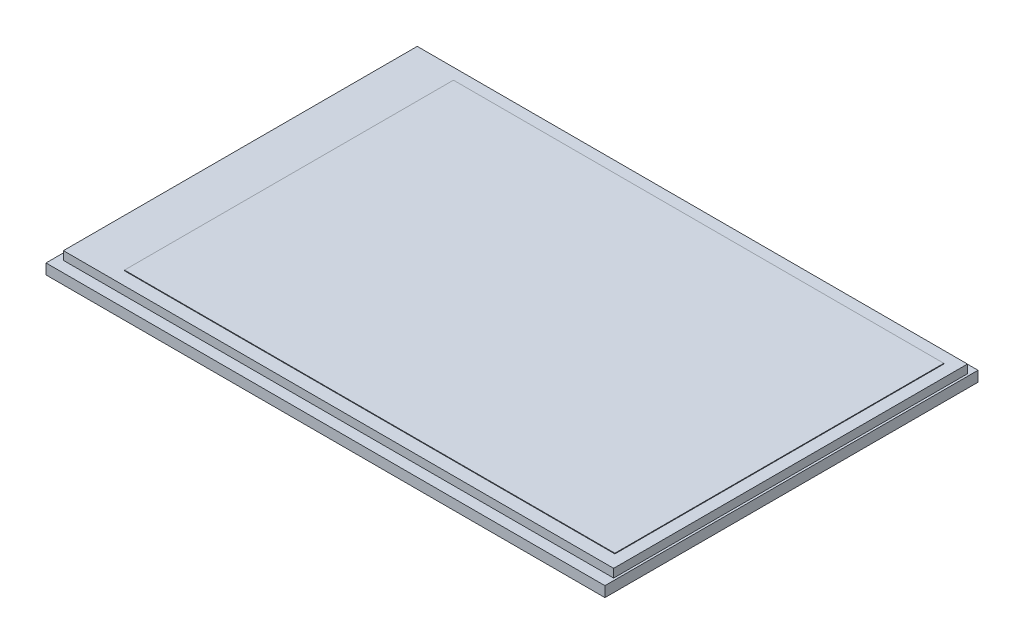
ISO-10303-21;
HEADER;
FILE_DESCRIPTION(('STEP AP214'),'2;1');
FILE_NAME('part.step','',(''),(''),'','','');
FILE_SCHEMA(('AUTOMOTIVE_DESIGN { 1 0 10303 214 1 1 1 1 }'));
ENDSEC;
DATA;
#1=APPLICATION_CONTEXT('core data for automotive mechanical design processes');
#2=APPLICATION_PROTOCOL_DEFINITION('international standard','automotive_design',2000,#1);
#3=PRODUCT_CONTEXT('',#1,'mechanical');
#4=PRODUCT('Part','Part','',(#3));
#5=PRODUCT_RELATED_PRODUCT_CATEGORY('part','',(#4));
#6=PRODUCT_DEFINITION_FORMATION('','',#4);
#7=PRODUCT_DEFINITION_CONTEXT('part definition',#1,'design');
#8=PRODUCT_DEFINITION('design','',#6,#7);
#9=PRODUCT_DEFINITION_SHAPE('','',#8);
#10=(LENGTH_UNIT() NAMED_UNIT(*) SI_UNIT(.MILLI.,.METRE.));
#11=(NAMED_UNIT(*) PLANE_ANGLE_UNIT() SI_UNIT($,.RADIAN.));
#12=(NAMED_UNIT(*) SI_UNIT($,.STERADIAN.) SOLID_ANGLE_UNIT());
#13=UNCERTAINTY_MEASURE_WITH_UNIT(LENGTH_MEASURE(1.E-05),#10,'distance_accuracy_value','');
#14=(GEOMETRIC_REPRESENTATION_CONTEXT(3) GLOBAL_UNCERTAINTY_ASSIGNED_CONTEXT((#13)) GLOBAL_UNIT_ASSIGNED_CONTEXT((#10,
#11,#12)) REPRESENTATION_CONTEXT('',''));
#15=CARTESIAN_POINT('',(0.,0.,0.));
#16=DIRECTION('',(0.,0.,1.));
#17=DIRECTION('',(1.,0.,0.));
#18=AXIS2_PLACEMENT_3D('',#15,#16,#17);
#19=CARTESIAN_POINT('',(0.,0.,0.));
#20=DIRECTION('',(0.,1.,0.));
#21=DIRECTION('',(0.,0.,1.));
#22=AXIS2_PLACEMENT_3D('',#19,#20,#21);
#23=PLANE('',#22);
#24=DIRECTION('',(0.,0.,1.));
#25=VECTOR('',#24,1.);
#26=CARTESIAN_POINT('',(-44.7916666666667,0.,-23.8888888888888));
#27=LINE('',#26,#25);
#28=CARTESIAN_POINT('',(-44.7916666666667,0.,-23.8888888888888));
#29=VERTEX_POINT('',#28);
#30=CARTESIAN_POINT('',(-44.7916666666667,0.,33.5111111111112));
#31=VERTEX_POINT('',#30);
#32=EDGE_CURVE('E244',#29,#31,#27,.T.);
#33=ORIENTED_EDGE('',*,*,#32,.F.);
#34=DIRECTION('',(-1.,0.,0.));
#35=VECTOR('',#34,1.);
#36=CARTESIAN_POINT('',(-44.7916666666667,0.,-23.8888888888888));
#37=LINE('',#36,#35);
#38=CARTESIAN_POINT('',(41.2083333333333,0.,-23.8888888888888));
#39=VERTEX_POINT('',#38);
#40=EDGE_CURVE('E249',#39,#29,#37,.T.);
#41=ORIENTED_EDGE('',*,*,#40,.F.);
#42=DIRECTION('',(0.,0.,-1.));
#43=VECTOR('',#42,1.);
#44=CARTESIAN_POINT('',(41.2083333333333,0.,-23.8888888888888));
#45=LINE('',#44,#43);
#46=CARTESIAN_POINT('',(41.2083333333333,0.,33.5111111111112));
#47=VERTEX_POINT('',#46);
#48=EDGE_CURVE('E260',#47,#39,#45,.T.);
#49=ORIENTED_EDGE('',*,*,#48,.F.);
#50=DIRECTION('',(1.,0.,0.));
#51=VECTOR('',#50,1.);
#52=CARTESIAN_POINT('',(-44.7916666666667,0.,33.5111111111112));
#53=LINE('',#52,#51);
#54=EDGE_CURVE('E258',#31,#47,#53,.T.);
#55=ORIENTED_EDGE('',*,*,#54,.F.);
#56=EDGE_LOOP('',(#33,#41,#49,#55));
#57=FACE_BOUND('',#56,.T.);
#58=DIRECTION('',(0.,0.,-1.));
#59=VECTOR('',#58,1.);
#60=CARTESIAN_POINT('',(-37.2516666666667,0.,-17.1988888888888));
#61=LINE('',#60,#59);
#62=CARTESIAN_POINT('',(-37.2516666666667,0.,-17.1988888888888));
#63=VERTEX_POINT('',#62);
#64=CARTESIAN_POINT('',(-37.2516666666667,0.,-22.1988888888888));
#65=VERTEX_POINT('',#64);
#66=EDGE_CURVE('E172',#63,#65,#61,.T.);
#67=ORIENTED_EDGE('',*,*,#66,.F.);
#68=DIRECTION('',(-1.,0.,0.));
#69=VECTOR('',#68,1.);
#70=CARTESIAN_POINT('',(-37.2516666666667,0.,-17.1988888888888));
#71=LINE('',#70,#69);
#72=CARTESIAN_POINT('',(13.9183333333333,0.,-17.1988888888888));
#73=VERTEX_POINT('',#72);
#74=EDGE_CURVE('E169',#73,#63,#71,.T.);
#75=ORIENTED_EDGE('',*,*,#74,.F.);
#76=DIRECTION('',(0.,0.,1.));
#77=VECTOR('',#76,1.);
#78=CARTESIAN_POINT('',(13.9183333333333,0.,-17.1988888888888));
#79=LINE('',#78,#77);
#80=CARTESIAN_POINT('',(13.9183333333333,0.,-22.1988888888888));
#81=VERTEX_POINT('',#80);
#82=EDGE_CURVE('E59',#81,#73,#79,.T.);
#83=ORIENTED_EDGE('',*,*,#82,.F.);
#84=DIRECTION('',(1.,0.,0.));
#85=VECTOR('',#84,1.);
#86=CARTESIAN_POINT('',(-37.2516666666667,0.,-22.1988888888888));
#87=LINE('',#86,#85);
#88=EDGE_CURVE('E54',#65,#81,#87,.T.);
#89=ORIENTED_EDGE('',*,*,#88,.F.);
#90=EDGE_LOOP('',(#67,#75,#83,#89));
#91=FACE_BOUND('',#90,.T.);
#92=ADVANCED_FACE('F39',(#57,#91),#23,.F.);
#93=CARTESIAN_POINT('',(-44.7916666666667,1.6,-23.8888888888888));
#94=DIRECTION('',(1.,0.,0.));
#95=DIRECTION('',(0.,0.,-1.));
#96=AXIS2_PLACEMENT_3D('',#93,#94,#95);
#97=PLANE('',#96);
#98=ORIENTED_EDGE('',*,*,#32,.T.);
#99=DIRECTION('',(0.,-1.,0.));
#100=VECTOR('',#99,1.);
#101=CARTESIAN_POINT('',(-44.7916666666667,1.6,33.5111111111112));
#102=LINE('',#101,#100);
#103=CARTESIAN_POINT('',(-44.7916666666667,1.6,33.5111111111112));
#104=VERTEX_POINT('',#103);
#105=EDGE_CURVE('E11',#104,#31,#102,.T.);
#106=ORIENTED_EDGE('',*,*,#105,.F.);
#107=DIRECTION('',(0.,0.,1.));
#108=VECTOR('',#107,1.);
#109=CARTESIAN_POINT('',(-44.7916666666667,1.6,-23.8888888888888));
#110=LINE('',#109,#108);
#111=CARTESIAN_POINT('',(-44.7916666666667,1.6,-23.8888888888888));
#112=VERTEX_POINT('',#111);
#113=EDGE_CURVE('E245',#112,#104,#110,.T.);
#114=ORIENTED_EDGE('',*,*,#113,.F.);
#115=DIRECTION('',(0.,-1.,0.));
#116=VECTOR('',#115,1.);
#117=CARTESIAN_POINT('',(-44.7916666666667,1.6,-23.8888888888888));
#118=LINE('',#117,#116);
#119=EDGE_CURVE('E255',#112,#29,#118,.T.);
#120=ORIENTED_EDGE('',*,*,#119,.T.);
#121=EDGE_LOOP('',(#98,#106,#114,#120));
#122=FACE_BOUND('',#121,.T.);
#123=ADVANCED_FACE('F41',(#122),#97,.F.);
#124=CARTESIAN_POINT('',(-44.7916666666667,1.6,33.5111111111112));
#125=DIRECTION('',(0.,0.,-1.));
#126=DIRECTION('',(-1.,0.,0.));
#127=AXIS2_PLACEMENT_3D('',#124,#125,#126);
#128=PLANE('',#127);
#129=ORIENTED_EDGE('',*,*,#54,.T.);
#130=DIRECTION('',(0.,-1.,0.));
#131=VECTOR('',#130,1.);
#132=CARTESIAN_POINT('',(41.2083333333333,1.6,33.5111111111112));
#133=LINE('',#132,#131);
#134=CARTESIAN_POINT('',(41.2083333333333,1.6,33.5111111111112));
#135=VERTEX_POINT('',#134);
#136=EDGE_CURVE('E47',#135,#47,#133,.T.);
#137=ORIENTED_EDGE('',*,*,#136,.F.);
#138=DIRECTION('',(1.,0.,0.));
#139=VECTOR('',#138,1.);
#140=CARTESIAN_POINT('',(-44.7916666666667,1.6,33.5111111111112));
#141=LINE('',#140,#139);
#142=EDGE_CURVE('E248',#104,#135,#141,.T.);
#143=ORIENTED_EDGE('',*,*,#142,.F.);
#144=ORIENTED_EDGE('',*,*,#105,.T.);
#145=EDGE_LOOP('',(#129,#137,#143,#144));
#146=FACE_BOUND('',#145,.T.);
#147=ADVANCED_FACE('F287',(#146),#128,.F.);
#148=CARTESIAN_POINT('',(41.2083333333333,1.6,-23.8888888888888));
#149=DIRECTION('',(-1.,0.,0.));
#150=DIRECTION('',(0.,0.,1.));
#151=AXIS2_PLACEMENT_3D('',#148,#149,#150);
#152=PLANE('',#151);
#153=ORIENTED_EDGE('',*,*,#48,.T.);
#154=DIRECTION('',(0.,-1.,0.));
#155=VECTOR('',#154,1.);
#156=CARTESIAN_POINT('',(41.2083333333333,1.6,-23.8888888888888));
#157=LINE('',#156,#155);
#158=CARTESIAN_POINT('',(41.2083333333333,1.6,-23.8888888888888));
#159=VERTEX_POINT('',#158);
#160=EDGE_CURVE('E265',#159,#39,#157,.T.);
#161=ORIENTED_EDGE('',*,*,#160,.F.);
#162=DIRECTION('',(0.,0.,-1.));
#163=VECTOR('',#162,1.);
#164=CARTESIAN_POINT('',(41.2083333333333,1.6,-23.8888888888888));
#165=LINE('',#164,#163);
#166=EDGE_CURVE('E251',#135,#159,#165,.T.);
#167=ORIENTED_EDGE('',*,*,#166,.F.);
#168=ORIENTED_EDGE('',*,*,#136,.T.);
#169=EDGE_LOOP('',(#153,#161,#167,#168));
#170=FACE_BOUND('',#169,.T.);
#171=ADVANCED_FACE('F272',(#170),#152,.F.);
#172=CARTESIAN_POINT('',(-44.7916666666667,1.6,-23.8888888888888));
#173=DIRECTION('',(0.,0.,1.));
#174=DIRECTION('',(1.,0.,0.));
#175=AXIS2_PLACEMENT_3D('',#172,#173,#174);
#176=PLANE('',#175);
#177=ORIENTED_EDGE('',*,*,#40,.T.);
#178=ORIENTED_EDGE('',*,*,#119,.F.);
#179=DIRECTION('',(-1.,0.,0.));
#180=VECTOR('',#179,1.);
#181=CARTESIAN_POINT('',(-44.7916666666667,1.6,-23.8888888888888));
#182=LINE('',#181,#180);
#183=EDGE_CURVE('E253',#159,#112,#182,.T.);
#184=ORIENTED_EDGE('',*,*,#183,.F.);
#185=ORIENTED_EDGE('',*,*,#160,.T.);
#186=EDGE_LOOP('',(#177,#178,#184,#185));
#187=FACE_BOUND('',#186,.T.);
#188=ADVANCED_FACE('F280',(#187),#176,.F.);
#189=CARTESIAN_POINT('',(0.,1.6,0.));
#190=DIRECTION('',(0.,1.,0.));
#191=DIRECTION('',(0.,0.,1.));
#192=AXIS2_PLACEMENT_3D('',#189,#190,#191);
#193=PLANE('',#192);
#194=DIRECTION('',(0.,0.,1.));
#195=VECTOR('',#194,1.);
#196=CARTESIAN_POINT('',(-43.7916666666667,1.6,-22.6088888888888));
#197=LINE('',#196,#195);
#198=CARTESIAN_POINT('',(-43.7916666666667,1.6,-22.6088888888888));
#199=VERTEX_POINT('',#198);
#200=CARTESIAN_POINT('',(-43.7916666666667,1.6,31.8311111111112));
#201=VERTEX_POINT('',#200);
#202=EDGE_CURVE('E211',#199,#201,#197,.T.);
#203=ORIENTED_EDGE('',*,*,#202,.F.);
#204=DIRECTION('',(-1.,0.,0.));
#205=VECTOR('',#204,1.);
#206=CARTESIAN_POINT('',(-43.7916666666667,1.6,-22.6088888888888));
#207=LINE('',#206,#205);
#208=CARTESIAN_POINT('',(40.8683333333333,1.6,-22.6088888888888));
#209=VERTEX_POINT('',#208);
#210=EDGE_CURVE('E216',#209,#199,#207,.T.);
#211=ORIENTED_EDGE('',*,*,#210,.F.);
#212=DIRECTION('',(0.,0.,-1.));
#213=VECTOR('',#212,1.);
#214=CARTESIAN_POINT('',(40.8683333333333,1.6,-22.6088888888888));
#215=LINE('',#214,#213);
#216=CARTESIAN_POINT('',(40.8683333333333,1.6,31.8311111111112));
#217=VERTEX_POINT('',#216);
#218=EDGE_CURVE('E228',#217,#209,#215,.T.);
#219=ORIENTED_EDGE('',*,*,#218,.F.);
#220=DIRECTION('',(1.,0.,0.));
#221=VECTOR('',#220,1.);
#222=CARTESIAN_POINT('',(-43.7916666666667,1.6,31.8311111111112));
#223=LINE('',#222,#221);
#224=EDGE_CURVE('E225',#201,#217,#223,.T.);
#225=ORIENTED_EDGE('',*,*,#224,.F.);
#226=EDGE_LOOP('',(#203,#211,#219,#225));
#227=FACE_BOUND('',#226,.T.);
#228=ORIENTED_EDGE('',*,*,#113,.T.);
#229=ORIENTED_EDGE('',*,*,#142,.T.);
#230=ORIENTED_EDGE('',*,*,#166,.T.);
#231=ORIENTED_EDGE('',*,*,#183,.T.);
#232=EDGE_LOOP('',(#228,#229,#230,#231));
#233=FACE_BOUND('',#232,.T.);
#234=ADVANCED_FACE('F286',(#227,#233),#193,.T.);
#235=CARTESIAN_POINT('',(-43.7916666666667,2.9,-22.6088888888888));
#236=DIRECTION('',(1.,0.,0.));
#237=DIRECTION('',(0.,0.,-1.));
#238=AXIS2_PLACEMENT_3D('',#235,#236,#237);
#239=PLANE('',#238);
#240=ORIENTED_EDGE('',*,*,#202,.T.);
#241=DIRECTION('',(0.,-1.,0.));
#242=VECTOR('',#241,1.);
#243=CARTESIAN_POINT('',(-43.7916666666667,2.9,31.8311111111112));
#244=LINE('',#243,#242);
#245=CARTESIAN_POINT('',(-43.7916666666667,2.9,31.8311111111112));
#246=VERTEX_POINT('',#245);
#247=EDGE_CURVE('E241',#246,#201,#244,.T.);
#248=ORIENTED_EDGE('',*,*,#247,.F.);
#249=DIRECTION('',(0.,0.,1.));
#250=VECTOR('',#249,1.);
#251=CARTESIAN_POINT('',(-43.7916666666667,2.9,-22.6088888888888));
#252=LINE('',#251,#250);
#253=CARTESIAN_POINT('',(-43.7916666666667,2.9,-22.6088888888888));
#254=VERTEX_POINT('',#253);
#255=EDGE_CURVE('E212',#254,#246,#252,.T.);
#256=ORIENTED_EDGE('',*,*,#255,.F.);
#257=DIRECTION('',(0.,-1.,0.));
#258=VECTOR('',#257,1.);
#259=CARTESIAN_POINT('',(-43.7916666666667,2.9,-22.6088888888888));
#260=LINE('',#259,#258);
#261=EDGE_CURVE('E222',#254,#199,#260,.T.);
#262=ORIENTED_EDGE('',*,*,#261,.T.);
#263=EDGE_LOOP('',(#240,#248,#256,#262));
#264=FACE_BOUND('',#263,.T.);
#265=ADVANCED_FACE('F305',(#264),#239,.F.);
#266=CARTESIAN_POINT('',(-43.7916666666667,2.9,31.8311111111112));
#267=DIRECTION('',(0.,0.,-1.));
#268=DIRECTION('',(-1.,0.,0.));
#269=AXIS2_PLACEMENT_3D('',#266,#267,#268);
#270=PLANE('',#269);
#271=ORIENTED_EDGE('',*,*,#224,.T.);
#272=DIRECTION('',(0.,-1.,0.));
#273=VECTOR('',#272,1.);
#274=CARTESIAN_POINT('',(40.8683333333333,2.9,31.8311111111112));
#275=LINE('',#274,#273);
#276=CARTESIAN_POINT('',(40.8683333333333,2.9,31.8311111111112));
#277=VERTEX_POINT('',#276);
#278=EDGE_CURVE('E238',#277,#217,#275,.T.);
#279=ORIENTED_EDGE('',*,*,#278,.F.);
#280=DIRECTION('',(1.,0.,0.));
#281=VECTOR('',#280,1.);
#282=CARTESIAN_POINT('',(-43.7916666666667,2.9,31.8311111111112));
#283=LINE('',#282,#281);
#284=EDGE_CURVE('E215',#246,#277,#283,.T.);
#285=ORIENTED_EDGE('',*,*,#284,.F.);
#286=ORIENTED_EDGE('',*,*,#247,.T.);
#287=EDGE_LOOP('',(#271,#279,#285,#286));
#288=FACE_BOUND('',#287,.T.);
#289=ADVANCED_FACE('F310',(#288),#270,.F.);
#290=CARTESIAN_POINT('',(40.8683333333333,2.9,-22.6088888888888));
#291=DIRECTION('',(-1.,0.,0.));
#292=DIRECTION('',(0.,0.,1.));
#293=AXIS2_PLACEMENT_3D('',#290,#291,#292);
#294=PLANE('',#293);
#295=ORIENTED_EDGE('',*,*,#218,.T.);
#296=DIRECTION('',(0.,-1.,0.));
#297=VECTOR('',#296,1.);
#298=CARTESIAN_POINT('',(40.8683333333333,2.9,-22.6088888888888));
#299=LINE('',#298,#297);
#300=CARTESIAN_POINT('',(40.8683333333333,2.9,-22.6088888888888));
#301=VERTEX_POINT('',#300);
#302=EDGE_CURVE('E235',#301,#209,#299,.T.);
#303=ORIENTED_EDGE('',*,*,#302,.F.);
#304=DIRECTION('',(0.,0.,-1.));
#305=VECTOR('',#304,1.);
#306=CARTESIAN_POINT('',(40.8683333333333,2.9,-22.6088888888888));
#307=LINE('',#306,#305);
#308=EDGE_CURVE('E218',#277,#301,#307,.T.);
#309=ORIENTED_EDGE('',*,*,#308,.F.);
#310=ORIENTED_EDGE('',*,*,#278,.T.);
#311=EDGE_LOOP('',(#295,#303,#309,#310));
#312=FACE_BOUND('',#311,.T.);
#313=ADVANCED_FACE('F324',(#312),#294,.F.);
#314=CARTESIAN_POINT('',(-43.7916666666667,2.9,-22.6088888888888));
#315=DIRECTION('',(0.,0.,1.));
#316=DIRECTION('',(1.,0.,0.));
#317=AXIS2_PLACEMENT_3D('',#314,#315,#316);
#318=PLANE('',#317);
#319=ORIENTED_EDGE('',*,*,#210,.T.);
#320=ORIENTED_EDGE('',*,*,#261,.F.);
#321=DIRECTION('',(-1.,0.,0.));
#322=VECTOR('',#321,1.);
#323=CARTESIAN_POINT('',(-43.7916666666667,2.9,-22.6088888888888));
#324=LINE('',#323,#322);
#325=EDGE_CURVE('E220',#301,#254,#324,.T.);
#326=ORIENTED_EDGE('',*,*,#325,.F.);
#327=ORIENTED_EDGE('',*,*,#302,.T.);
#328=EDGE_LOOP('',(#319,#320,#326,#327));
#329=FACE_BOUND('',#328,.T.);
#330=ADVANCED_FACE('F315',(#329),#318,.F.);
#331=CARTESIAN_POINT('',(0.,2.9,0.));
#332=DIRECTION('',(0.,1.,0.));
#333=DIRECTION('',(0.,0.,1.));
#334=AXIS2_PLACEMENT_3D('',#331,#332,#333);
#335=PLANE('',#334);
#336=DIRECTION('',(0.,0.,1.));
#337=VECTOR('',#336,1.);
#338=CARTESIAN_POINT('',(-36.4016666666667,2.9,-20.7888888888888));
#339=LINE('',#338,#337);
#340=CARTESIAN_POINT('',(-36.4016666666667,2.9,-20.7888888888888));
#341=VERTEX_POINT('',#340);
#342=CARTESIAN_POINT('',(-36.4016666666667,2.9,29.8211111111112));
#343=VERTEX_POINT('',#342);
#344=EDGE_CURVE('E173',#341,#343,#339,.T.);
#345=ORIENTED_EDGE('',*,*,#344,.F.);
#346=DIRECTION('',(-1.,0.,0.));
#347=VECTOR('',#346,1.);
#348=CARTESIAN_POINT('',(-36.4016666666667,2.9,-20.7888888888888));
#349=LINE('',#348,#347);
#350=CARTESIAN_POINT('',(39.0483333333333,2.9,-20.7888888888888));
#351=VERTEX_POINT('',#350);
#352=EDGE_CURVE('E186',#351,#341,#349,.T.);
#353=ORIENTED_EDGE('',*,*,#352,.F.);
#354=DIRECTION('',(0.,0.,-1.));
#355=VECTOR('',#354,1.);
#356=CARTESIAN_POINT('',(39.0483333333333,2.9,-20.7888888888888));
#357=LINE('',#356,#355);
#358=CARTESIAN_POINT('',(39.0483333333333,2.9,29.8211111111112));
#359=VERTEX_POINT('',#358);
#360=EDGE_CURVE('E195',#359,#351,#357,.T.);
#361=ORIENTED_EDGE('',*,*,#360,.F.);
#362=DIRECTION('',(1.,0.,0.));
#363=VECTOR('',#362,1.);
#364=CARTESIAN_POINT('',(-36.4016666666667,2.9,29.8211111111112));
#365=LINE('',#364,#363);
#366=EDGE_CURVE('E176',#343,#359,#365,.T.);
#367=ORIENTED_EDGE('',*,*,#366,.F.);
#368=EDGE_LOOP('',(#345,#353,#361,#367));
#369=FACE_BOUND('',#368,.T.);
#370=ORIENTED_EDGE('',*,*,#255,.T.);
#371=ORIENTED_EDGE('',*,*,#284,.T.);
#372=ORIENTED_EDGE('',*,*,#308,.T.);
#373=ORIENTED_EDGE('',*,*,#325,.T.);
#374=EDGE_LOOP('',(#370,#371,#372,#373));
#375=FACE_BOUND('',#374,.T.);
#376=ADVANCED_FACE('F320',(#369,#375),#335,.T.);
#377=CARTESIAN_POINT('',(-36.4016666666667,3.,-20.7888888888888));
#378=DIRECTION('',(1.,0.,0.));
#379=DIRECTION('',(0.,0.,-1.));
#380=AXIS2_PLACEMENT_3D('',#377,#378,#379);
#381=PLANE('',#380);
#382=ORIENTED_EDGE('',*,*,#344,.T.);
#383=DIRECTION('',(0.,-1.,0.));
#384=VECTOR('',#383,1.);
#385=CARTESIAN_POINT('',(-36.4016666666667,3.,29.8211111111112));
#386=LINE('',#385,#384);
#387=CARTESIAN_POINT('',(-36.4016666666667,3.,29.8211111111112));
#388=VERTEX_POINT('',#387);
#389=EDGE_CURVE('E208',#388,#343,#386,.T.);
#390=ORIENTED_EDGE('',*,*,#389,.F.);
#391=DIRECTION('',(0.,0.,1.));
#392=VECTOR('',#391,1.);
#393=CARTESIAN_POINT('',(-36.4016666666667,3.,-20.7888888888888));
#394=LINE('',#393,#392);
#395=CARTESIAN_POINT('',(-36.4016666666667,3.,-20.7888888888888));
#396=VERTEX_POINT('',#395);
#397=EDGE_CURVE('E182',#396,#388,#394,.T.);
#398=ORIENTED_EDGE('',*,*,#397,.F.);
#399=DIRECTION('',(0.,-1.,0.));
#400=VECTOR('',#399,1.);
#401=CARTESIAN_POINT('',(-36.4016666666667,3.,-20.7888888888888));
#402=LINE('',#401,#400);
#403=EDGE_CURVE('E191',#396,#341,#402,.T.);
#404=ORIENTED_EDGE('',*,*,#403,.T.);
#405=EDGE_LOOP('',(#382,#390,#398,#404));
#406=FACE_BOUND('',#405,.T.);
#407=ADVANCED_FACE('F337',(#406),#381,.F.);
#408=CARTESIAN_POINT('',(-36.4016666666667,3.,29.8211111111112));
#409=DIRECTION('',(0.,0.,-1.));
#410=DIRECTION('',(-1.,0.,0.));
#411=AXIS2_PLACEMENT_3D('',#408,#409,#410);
#412=PLANE('',#411);
#413=ORIENTED_EDGE('',*,*,#366,.T.);
#414=DIRECTION('',(0.,-1.,0.));
#415=VECTOR('',#414,1.);
#416=CARTESIAN_POINT('',(39.0483333333333,3.,29.8211111111112));
#417=LINE('',#416,#415);
#418=CARTESIAN_POINT('',(39.0483333333333,3.,29.8211111111112));
#419=VERTEX_POINT('',#418);
#420=EDGE_CURVE('E205',#419,#359,#417,.T.);
#421=ORIENTED_EDGE('',*,*,#420,.F.);
#422=DIRECTION('',(1.,0.,0.));
#423=VECTOR('',#422,1.);
#424=CARTESIAN_POINT('',(-36.4016666666667,3.,29.8211111111112));
#425=LINE('',#424,#423);
#426=EDGE_CURVE('E185',#388,#419,#425,.T.);
#427=ORIENTED_EDGE('',*,*,#426,.F.);
#428=ORIENTED_EDGE('',*,*,#389,.T.);
#429=EDGE_LOOP('',(#413,#421,#427,#428));
#430=FACE_BOUND('',#429,.T.);
#431=ADVANCED_FACE('F341',(#430),#412,.F.);
#432=CARTESIAN_POINT('',(39.0483333333333,3.,-20.7888888888888));
#433=DIRECTION('',(-1.,0.,0.));
#434=DIRECTION('',(0.,0.,1.));
#435=AXIS2_PLACEMENT_3D('',#432,#433,#434);
#436=PLANE('',#435);
#437=ORIENTED_EDGE('',*,*,#360,.T.);
#438=DIRECTION('',(0.,-1.,0.));
#439=VECTOR('',#438,1.);
#440=CARTESIAN_POINT('',(39.0483333333333,3.,-20.7888888888888));
#441=LINE('',#440,#439);
#442=CARTESIAN_POINT('',(39.0483333333333,3.,-20.7888888888888));
#443=VERTEX_POINT('',#442);
#444=EDGE_CURVE('E202',#443,#351,#441,.T.);
#445=ORIENTED_EDGE('',*,*,#444,.F.);
#446=DIRECTION('',(0.,0.,-1.));
#447=VECTOR('',#446,1.);
#448=CARTESIAN_POINT('',(39.0483333333333,3.,-20.7888888888888));
#449=LINE('',#448,#447);
#450=EDGE_CURVE('E188',#419,#443,#449,.T.);
#451=ORIENTED_EDGE('',*,*,#450,.F.);
#452=ORIENTED_EDGE('',*,*,#420,.T.);
#453=EDGE_LOOP('',(#437,#445,#451,#452));
#454=FACE_BOUND('',#453,.T.);
#455=ADVANCED_FACE('F345',(#454),#436,.F.);
#456=CARTESIAN_POINT('',(-36.4016666666667,3.,-20.7888888888888));
#457=DIRECTION('',(0.,0.,1.));
#458=DIRECTION('',(1.,0.,0.));
#459=AXIS2_PLACEMENT_3D('',#456,#457,#458);
#460=PLANE('',#459);
#461=ORIENTED_EDGE('',*,*,#352,.T.);
#462=ORIENTED_EDGE('',*,*,#403,.F.);
#463=DIRECTION('',(-1.,0.,0.));
#464=VECTOR('',#463,1.);
#465=CARTESIAN_POINT('',(-36.4016666666667,3.,-20.7888888888888));
#466=LINE('',#465,#464);
#467=EDGE_CURVE('E190',#443,#396,#466,.T.);
#468=ORIENTED_EDGE('',*,*,#467,.F.);
#469=ORIENTED_EDGE('',*,*,#444,.T.);
#470=EDGE_LOOP('',(#461,#462,#468,#469));
#471=FACE_BOUND('',#470,.T.);
#472=ADVANCED_FACE('F349',(#471),#460,.F.);
#473=CARTESIAN_POINT('',(0.,3.,0.));
#474=DIRECTION('',(0.,1.,0.));
#475=DIRECTION('',(0.,0.,1.));
#476=AXIS2_PLACEMENT_3D('',#473,#474,#475);
#477=PLANE('',#476);
#478=ORIENTED_EDGE('',*,*,#397,.T.);
#479=ORIENTED_EDGE('',*,*,#426,.T.);
#480=ORIENTED_EDGE('',*,*,#450,.T.);
#481=ORIENTED_EDGE('',*,*,#467,.T.);
#482=EDGE_LOOP('',(#478,#479,#480,#481));
#483=FACE_BOUND('',#482,.T.);
#484=ADVANCED_FACE('F353',(#483),#477,.T.);
#485=CARTESIAN_POINT('',(-37.2516666666667,-14.,-17.1988888888888));
#486=DIRECTION('',(1.,0.,0.));
#487=DIRECTION('',(0.,0.,-1.));
#488=AXIS2_PLACEMENT_3D('',#485,#486,#487);
#489=PLANE('',#488);
#490=ORIENTED_EDGE('',*,*,#66,.T.);
#491=DIRECTION('',(0.,1.,0.));
#492=VECTOR('',#491,1.);
#493=CARTESIAN_POINT('',(-37.2516666666667,-14.,-22.1988888888888));
#494=LINE('',#493,#492);
#495=CARTESIAN_POINT('',(-37.2516666666667,-14.,-22.1988888888888));
#496=VERTEX_POINT('',#495);
#497=EDGE_CURVE('E153',#496,#65,#494,.T.);
#498=ORIENTED_EDGE('',*,*,#497,.F.);
#499=DIRECTION('',(0.,0.,-1.));
#500=VECTOR('',#499,1.);
#501=CARTESIAN_POINT('',(-37.2516666666667,-14.,-17.1988888888888));
#502=LINE('',#501,#500);
#503=CARTESIAN_POINT('',(-37.2516666666667,-14.,-17.1988888888888));
#504=VERTEX_POINT('',#503);
#505=EDGE_CURVE('E160',#504,#496,#502,.T.);
#506=ORIENTED_EDGE('',*,*,#505,.F.);
#507=DIRECTION('',(0.,1.,0.));
#508=VECTOR('',#507,1.);
#509=CARTESIAN_POINT('',(-37.2516666666667,-14.,-17.1988888888888));
#510=LINE('',#509,#508);
#511=EDGE_CURVE('E531',#504,#63,#510,.T.);
#512=ORIENTED_EDGE('',*,*,#511,.T.);
#513=EDGE_LOOP('',(#490,#498,#506,#512));
#514=FACE_BOUND('',#513,.T.);
#515=ADVANCED_FACE('F171',(#514),#489,.F.);
#516=CARTESIAN_POINT('',(-37.2516666666667,-14.,-22.1988888888888));
#517=DIRECTION('',(0.,0.,1.));
#518=DIRECTION('',(1.,0.,0.));
#519=AXIS2_PLACEMENT_3D('',#516,#517,#518);
#520=PLANE('',#519);
#521=ORIENTED_EDGE('',*,*,#88,.T.);
#522=DIRECTION('',(0.,1.,0.));
#523=VECTOR('',#522,1.);
#524=CARTESIAN_POINT('',(13.9183333333333,-14.,-22.1988888888888));
#525=LINE('',#524,#523);
#526=CARTESIAN_POINT('',(13.9183333333333,-14.,-22.1988888888888));
#527=VERTEX_POINT('',#526);
#528=EDGE_CURVE('E156',#527,#81,#525,.T.);
#529=ORIENTED_EDGE('',*,*,#528,.F.);
#530=DIRECTION('',(1.,0.,0.));
#531=VECTOR('',#530,1.);
#532=CARTESIAN_POINT('',(-37.2516666666667,-14.,-22.1988888888888));
#533=LINE('',#532,#531);
#534=EDGE_CURVE('E149',#496,#527,#533,.T.);
#535=ORIENTED_EDGE('',*,*,#534,.F.);
#536=ORIENTED_EDGE('',*,*,#497,.T.);
#537=EDGE_LOOP('',(#521,#529,#535,#536));
#538=FACE_BOUND('',#537,.T.);
#539=ADVANCED_FACE('F151',(#538),#520,.F.);
#540=CARTESIAN_POINT('',(13.9183333333333,-14.,-17.1988888888888));
#541=DIRECTION('',(-1.,0.,0.));
#542=DIRECTION('',(0.,0.,1.));
#543=AXIS2_PLACEMENT_3D('',#540,#541,#542);
#544=PLANE('',#543);
#545=ORIENTED_EDGE('',*,*,#82,.T.);
#546=DIRECTION('',(0.,1.,0.));
#547=VECTOR('',#546,1.);
#548=CARTESIAN_POINT('',(13.9183333333333,-14.,-17.1988888888888));
#549=LINE('',#548,#547);
#550=CARTESIAN_POINT('',(13.9183333333333,-14.,-17.1988888888888));
#551=VERTEX_POINT('',#550);
#552=EDGE_CURVE('E178',#551,#73,#549,.T.);
#553=ORIENTED_EDGE('',*,*,#552,.F.);
#554=DIRECTION('',(0.,0.,1.));
#555=VECTOR('',#554,1.);
#556=CARTESIAN_POINT('',(13.9183333333333,-14.,-17.1988888888888));
#557=LINE('',#556,#555);
#558=EDGE_CURVE('E159',#527,#551,#557,.T.);
#559=ORIENTED_EDGE('',*,*,#558,.F.);
#560=ORIENTED_EDGE('',*,*,#528,.T.);
#561=EDGE_LOOP('',(#545,#553,#559,#560));
#562=FACE_BOUND('',#561,.T.);
#563=ADVANCED_FACE('F362',(#562),#544,.F.);
#564=CARTESIAN_POINT('',(-37.2516666666667,-14.,-17.1988888888888));
#565=DIRECTION('',(0.,0.,-1.));
#566=DIRECTION('',(-1.,0.,0.));
#567=AXIS2_PLACEMENT_3D('',#564,#565,#566);
#568=PLANE('',#567);
#569=ORIENTED_EDGE('',*,*,#74,.T.);
#570=ORIENTED_EDGE('',*,*,#511,.F.);
#571=DIRECTION('',(-1.,0.,0.));
#572=VECTOR('',#571,1.);
#573=CARTESIAN_POINT('',(-37.2516666666667,-14.,-17.1988888888888));
#574=LINE('',#573,#572);
#575=EDGE_CURVE('E165',#551,#504,#574,.T.);
#576=ORIENTED_EDGE('',*,*,#575,.F.);
#577=ORIENTED_EDGE('',*,*,#552,.T.);
#578=EDGE_LOOP('',(#569,#570,#576,#577));
#579=FACE_BOUND('',#578,.T.);
#580=ADVANCED_FACE('F365',(#579),#568,.F.);
#581=CARTESIAN_POINT('',(0.,-14.,0.));
#582=DIRECTION('',(0.,-1.,0.));
#583=DIRECTION('',(0.,0.,-1.));
#584=AXIS2_PLACEMENT_3D('',#581,#582,#583);
#585=PLANE('',#584);
#586=ORIENTED_EDGE('',*,*,#505,.T.);
#587=ORIENTED_EDGE('',*,*,#534,.T.);
#588=ORIENTED_EDGE('',*,*,#558,.T.);
#589=ORIENTED_EDGE('',*,*,#575,.T.);
#590=EDGE_LOOP('',(#586,#587,#588,#589));
#591=FACE_BOUND('',#590,.T.);
#592=ADVANCED_FACE('F163',(#591),#585,.T.);
#593=CLOSED_SHELL('',(#92,#123,#147,#171,#188,#234,#265,#289,#313,#330,#376,#407,#431,#455,#472,
#484,#515,#539,#563,#580,#592));
#594=MANIFOLD_SOLID_BREP('B2',#593);
#595=ADVANCED_BREP_SHAPE_REPRESENTATION('',(#18,#594),#14);
#596=SHAPE_DEFINITION_REPRESENTATION(#9,#595);
ENDSEC;
END-ISO-10303-21;
